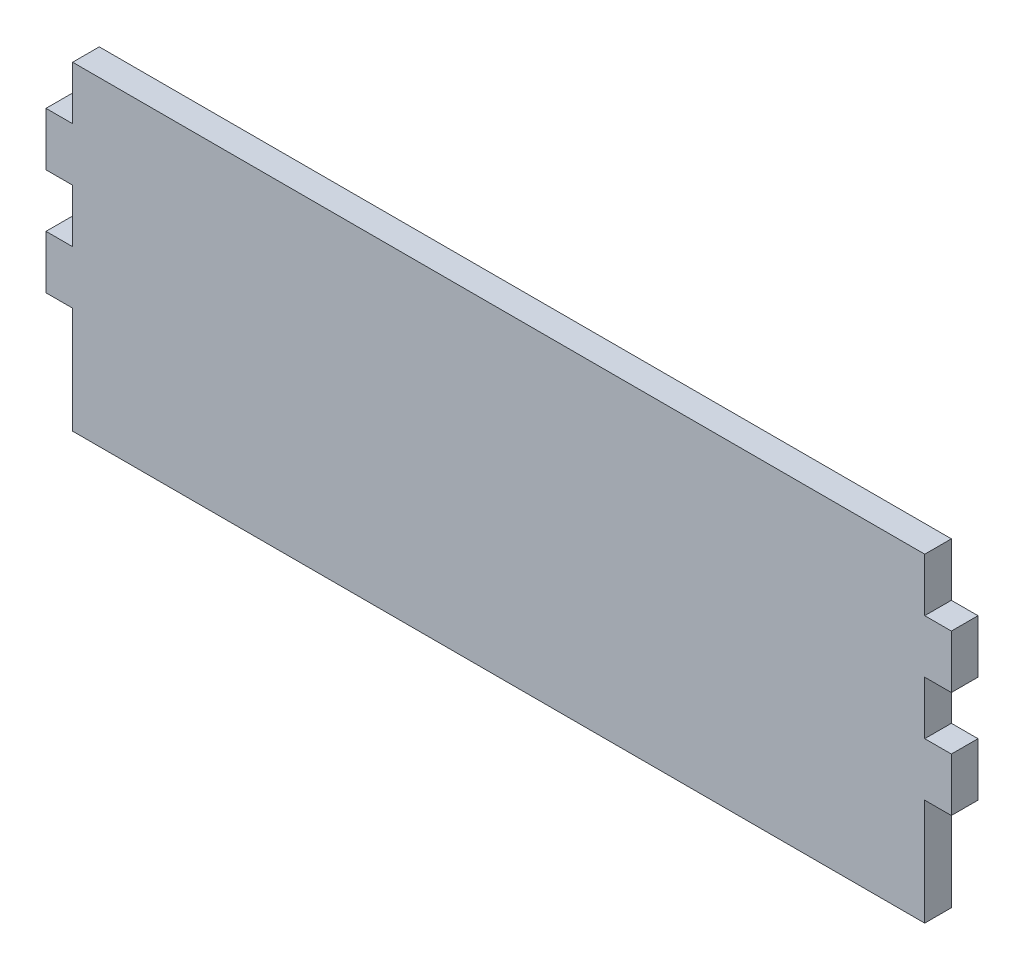
ISO-10303-21;
HEADER;
FILE_DESCRIPTION(('STEP AP214'),'2;1');
FILE_NAME('part.step','',(''),(''),'','','');
FILE_SCHEMA(('AUTOMOTIVE_DESIGN { 1 0 10303 214 1 1 1 1 }'));
ENDSEC;
DATA;
#1=APPLICATION_CONTEXT('core data for automotive mechanical design processes');
#2=APPLICATION_PROTOCOL_DEFINITION('international standard','automotive_design',2000,#1);
#3=PRODUCT_CONTEXT('',#1,'mechanical');
#4=PRODUCT('Part','Part','',(#3));
#5=PRODUCT_RELATED_PRODUCT_CATEGORY('part','',(#4));
#6=PRODUCT_DEFINITION_FORMATION('','',#4);
#7=PRODUCT_DEFINITION_CONTEXT('part definition',#1,'design');
#8=PRODUCT_DEFINITION('design','',#6,#7);
#9=PRODUCT_DEFINITION_SHAPE('','',#8);
#10=(LENGTH_UNIT() NAMED_UNIT(*) SI_UNIT(.MILLI.,.METRE.));
#11=(NAMED_UNIT(*) PLANE_ANGLE_UNIT() SI_UNIT($,.RADIAN.));
#12=(NAMED_UNIT(*) SI_UNIT($,.STERADIAN.) SOLID_ANGLE_UNIT());
#13=UNCERTAINTY_MEASURE_WITH_UNIT(LENGTH_MEASURE(1.E-05),#10,'distance_accuracy_value','');
#14=(GEOMETRIC_REPRESENTATION_CONTEXT(3) GLOBAL_UNCERTAINTY_ASSIGNED_CONTEXT((#13)) GLOBAL_UNIT_ASSIGNED_CONTEXT((#10,
#11,#12)) REPRESENTATION_CONTEXT('',''));
#15=CARTESIAN_POINT('',(0.,0.,0.));
#16=DIRECTION('',(0.,0.,1.));
#17=DIRECTION('',(1.,0.,0.));
#18=AXIS2_PLACEMENT_3D('',#15,#16,#17);
#19=CARTESIAN_POINT('',(40.,25.,2.5));
#20=DIRECTION('',(-1.,0.,0.));
#21=DIRECTION('',(0.,-1.,0.));
#22=AXIS2_PLACEMENT_3D('',#19,#20,#21);
#23=PLANE('',#22);
#24=DIRECTION('',(0.,1.,0.));
#25=VECTOR('',#24,1.);
#26=CARTESIAN_POINT('',(40.,25.,0.));
#27=LINE('',#26,#25);
#28=CARTESIAN_POINT('',(40.,25.,0.));
#29=VERTEX_POINT('',#28);
#30=CARTESIAN_POINT('',(40.,30.,0.));
#31=VERTEX_POINT('',#30);
#32=EDGE_CURVE('E201',#29,#31,#27,.T.);
#33=ORIENTED_EDGE('',*,*,#32,.T.);
#34=DIRECTION('',(0.,0.,-1.));
#35=VECTOR('',#34,1.);
#36=CARTESIAN_POINT('',(40.,30.,2.5));
#37=LINE('',#36,#35);
#38=CARTESIAN_POINT('',(40.,30.,2.5));
#39=VERTEX_POINT('',#38);
#40=EDGE_CURVE('E11',#39,#31,#37,.T.);
#41=ORIENTED_EDGE('',*,*,#40,.F.);
#42=DIRECTION('',(0.,1.,0.));
#43=VECTOR('',#42,1.);
#44=CARTESIAN_POINT('',(40.,25.,2.5));
#45=LINE('',#44,#43);
#46=CARTESIAN_POINT('',(40.,25.,2.5));
#47=VERTEX_POINT('',#46);
#48=EDGE_CURVE('E239',#47,#39,#45,.T.);
#49=ORIENTED_EDGE('',*,*,#48,.F.);
#50=DIRECTION('',(0.,0.,-1.));
#51=VECTOR('',#50,1.);
#52=CARTESIAN_POINT('',(40.,25.,2.5));
#53=LINE('',#52,#51);
#54=EDGE_CURVE('E197',#47,#29,#53,.T.);
#55=ORIENTED_EDGE('',*,*,#54,.T.);
#56=EDGE_LOOP('',(#33,#41,#49,#55));
#57=FACE_BOUND('',#56,.T.);
#58=ADVANCED_FACE('F33',(#57),#23,.F.);
#59=CARTESIAN_POINT('',(-40.,30.,2.5));
#60=DIRECTION('',(0.,-1.,0.));
#61=DIRECTION('',(0.,0.,-1.));
#62=AXIS2_PLACEMENT_3D('',#59,#60,#61);
#63=PLANE('',#62);
#64=DIRECTION('',(-1.,0.,0.));
#65=VECTOR('',#64,1.);
#66=CARTESIAN_POINT('',(-40.,30.,0.));
#67=LINE('',#66,#65);
#68=CARTESIAN_POINT('',(-40.,30.,0.));
#69=VERTEX_POINT('',#68);
#70=EDGE_CURVE('E204',#31,#69,#67,.T.);
#71=ORIENTED_EDGE('',*,*,#70,.T.);
#72=DIRECTION('',(0.,0.,-1.));
#73=VECTOR('',#72,1.);
#74=CARTESIAN_POINT('',(-40.,30.,2.5));
#75=LINE('',#74,#73);
#76=CARTESIAN_POINT('',(-40.,30.,2.5));
#77=VERTEX_POINT('',#76);
#78=EDGE_CURVE('E41',#77,#69,#75,.T.);
#79=ORIENTED_EDGE('',*,*,#78,.F.);
#80=DIRECTION('',(-1.,0.,0.));
#81=VECTOR('',#80,1.);
#82=CARTESIAN_POINT('',(-40.,30.,2.5));
#83=LINE('',#82,#81);
#84=EDGE_CURVE('E128',#39,#77,#83,.T.);
#85=ORIENTED_EDGE('',*,*,#84,.F.);
#86=ORIENTED_EDGE('',*,*,#40,.T.);
#87=EDGE_LOOP('',(#71,#79,#85,#86));
#88=FACE_BOUND('',#87,.T.);
#89=ADVANCED_FACE('F357',(#88),#63,.F.);
#90=CARTESIAN_POINT('',(-40.,25.,2.5));
#91=DIRECTION('',(1.,0.,0.));
#92=DIRECTION('',(0.,1.,0.));
#93=AXIS2_PLACEMENT_3D('',#90,#91,#92);
#94=PLANE('',#93);
#95=DIRECTION('',(0.,-1.,0.));
#96=VECTOR('',#95,1.);
#97=CARTESIAN_POINT('',(-40.,25.,0.));
#98=LINE('',#97,#96);
#99=CARTESIAN_POINT('',(-40.,25.,0.));
#100=VERTEX_POINT('',#99);
#101=EDGE_CURVE('E206',#69,#100,#98,.T.);
#102=ORIENTED_EDGE('',*,*,#101,.T.);
#103=DIRECTION('',(0.,0.,-1.));
#104=VECTOR('',#103,1.);
#105=CARTESIAN_POINT('',(-40.,25.,2.5));
#106=LINE('',#105,#104);
#107=CARTESIAN_POINT('',(-40.,25.,2.5));
#108=VERTEX_POINT('',#107);
#109=EDGE_CURVE('E282',#108,#100,#106,.T.);
#110=ORIENTED_EDGE('',*,*,#109,.F.);
#111=DIRECTION('',(0.,-1.,0.));
#112=VECTOR('',#111,1.);
#113=CARTESIAN_POINT('',(-40.,25.,2.5));
#114=LINE('',#113,#112);
#115=EDGE_CURVE('E290',#77,#108,#114,.T.);
#116=ORIENTED_EDGE('',*,*,#115,.F.);
#117=ORIENTED_EDGE('',*,*,#78,.T.);
#118=EDGE_LOOP('',(#102,#110,#116,#117));
#119=FACE_BOUND('',#118,.T.);
#120=ADVANCED_FACE('F288',(#119),#94,.F.);
#121=CARTESIAN_POINT('',(-40.,25.,2.5));
#122=DIRECTION('',(0.,-1.,0.));
#123=DIRECTION('',(0.,0.,-1.));
#124=AXIS2_PLACEMENT_3D('',#121,#122,#123);
#125=PLANE('',#124);
#126=DIRECTION('',(-1.,0.,0.));
#127=VECTOR('',#126,1.);
#128=CARTESIAN_POINT('',(-40.,25.,0.));
#129=LINE('',#128,#127);
#130=CARTESIAN_POINT('',(-42.5,25.,0.));
#131=VERTEX_POINT('',#130);
#132=EDGE_CURVE('E208',#100,#131,#129,.T.);
#133=ORIENTED_EDGE('',*,*,#132,.T.);
#134=DIRECTION('',(0.,0.,-1.));
#135=VECTOR('',#134,1.);
#136=CARTESIAN_POINT('',(-42.5,25.,2.5));
#137=LINE('',#136,#135);
#138=CARTESIAN_POINT('',(-42.5,25.,2.5));
#139=VERTEX_POINT('',#138);
#140=EDGE_CURVE('E279',#139,#131,#137,.T.);
#141=ORIENTED_EDGE('',*,*,#140,.F.);
#142=DIRECTION('',(-1.,0.,0.));
#143=VECTOR('',#142,1.);
#144=CARTESIAN_POINT('',(-40.,25.,2.5));
#145=LINE('',#144,#143);
#146=EDGE_CURVE('E308',#108,#139,#145,.T.);
#147=ORIENTED_EDGE('',*,*,#146,.F.);
#148=ORIENTED_EDGE('',*,*,#109,.T.);
#149=EDGE_LOOP('',(#133,#141,#147,#148));
#150=FACE_BOUND('',#149,.T.);
#151=ADVANCED_FACE('F299',(#150),#125,.F.);
#152=CARTESIAN_POINT('',(-42.5,25.,2.5));
#153=DIRECTION('',(1.,0.,0.));
#154=DIRECTION('',(0.,1.,0.));
#155=AXIS2_PLACEMENT_3D('',#152,#153,#154);
#156=PLANE('',#155);
#157=DIRECTION('',(0.,-1.,0.));
#158=VECTOR('',#157,1.);
#159=CARTESIAN_POINT('',(-42.5,25.,0.));
#160=LINE('',#159,#158);
#161=CARTESIAN_POINT('',(-42.5,20.,0.));
#162=VERTEX_POINT('',#161);
#163=EDGE_CURVE('E210',#131,#162,#160,.T.);
#164=ORIENTED_EDGE('',*,*,#163,.T.);
#165=DIRECTION('',(0.,0.,-1.));
#166=VECTOR('',#165,1.);
#167=CARTESIAN_POINT('',(-42.5,20.,2.5));
#168=LINE('',#167,#166);
#169=CARTESIAN_POINT('',(-42.5,20.,2.5));
#170=VERTEX_POINT('',#169);
#171=EDGE_CURVE('E276',#170,#162,#168,.T.);
#172=ORIENTED_EDGE('',*,*,#171,.F.);
#173=DIRECTION('',(0.,-1.,0.));
#174=VECTOR('',#173,1.);
#175=CARTESIAN_POINT('',(-42.5,25.,2.5));
#176=LINE('',#175,#174);
#177=EDGE_CURVE('E305',#139,#170,#176,.T.);
#178=ORIENTED_EDGE('',*,*,#177,.F.);
#179=ORIENTED_EDGE('',*,*,#140,.T.);
#180=EDGE_LOOP('',(#164,#172,#178,#179));
#181=FACE_BOUND('',#180,.T.);
#182=ADVANCED_FACE('F303',(#181),#156,.F.);
#183=CARTESIAN_POINT('',(-40.,20.,2.5));
#184=DIRECTION('',(0.,1.,0.));
#185=DIRECTION('',(0.,0.,1.));
#186=AXIS2_PLACEMENT_3D('',#183,#184,#185);
#187=PLANE('',#186);
#188=DIRECTION('',(1.,0.,0.));
#189=VECTOR('',#188,1.);
#190=CARTESIAN_POINT('',(-40.,20.,0.));
#191=LINE('',#190,#189);
#192=CARTESIAN_POINT('',(-40.,20.,0.));
#193=VERTEX_POINT('',#192);
#194=EDGE_CURVE('E212',#162,#193,#191,.T.);
#195=ORIENTED_EDGE('',*,*,#194,.T.);
#196=DIRECTION('',(0.,0.,-1.));
#197=VECTOR('',#196,1.);
#198=CARTESIAN_POINT('',(-40.,20.,2.5));
#199=LINE('',#198,#197);
#200=CARTESIAN_POINT('',(-40.,20.,2.5));
#201=VERTEX_POINT('',#200);
#202=EDGE_CURVE('E273',#201,#193,#199,.T.);
#203=ORIENTED_EDGE('',*,*,#202,.F.);
#204=DIRECTION('',(1.,0.,0.));
#205=VECTOR('',#204,1.);
#206=CARTESIAN_POINT('',(-40.,20.,2.5));
#207=LINE('',#206,#205);
#208=EDGE_CURVE('E307',#170,#201,#207,.T.);
#209=ORIENTED_EDGE('',*,*,#208,.F.);
#210=ORIENTED_EDGE('',*,*,#171,.T.);
#211=EDGE_LOOP('',(#195,#203,#209,#210));
#212=FACE_BOUND('',#211,.T.);
#213=ADVANCED_FACE('F370',(#212),#187,.F.);
#214=CARTESIAN_POINT('',(-40.,15.,2.5));
#215=DIRECTION('',(1.,0.,0.));
#216=DIRECTION('',(0.,1.,0.));
#217=AXIS2_PLACEMENT_3D('',#214,#215,#216);
#218=PLANE('',#217);
#219=DIRECTION('',(0.,-1.,0.));
#220=VECTOR('',#219,1.);
#221=CARTESIAN_POINT('',(-40.,15.,0.));
#222=LINE('',#221,#220);
#223=CARTESIAN_POINT('',(-40.,15.,0.));
#224=VERTEX_POINT('',#223);
#225=EDGE_CURVE('E214',#193,#224,#222,.T.);
#226=ORIENTED_EDGE('',*,*,#225,.T.);
#227=DIRECTION('',(0.,0.,-1.));
#228=VECTOR('',#227,1.);
#229=CARTESIAN_POINT('',(-40.,15.,2.5));
#230=LINE('',#229,#228);
#231=CARTESIAN_POINT('',(-40.,15.,2.5));
#232=VERTEX_POINT('',#231);
#233=EDGE_CURVE('E270',#232,#224,#230,.T.);
#234=ORIENTED_EDGE('',*,*,#233,.F.);
#235=DIRECTION('',(0.,-1.,0.));
#236=VECTOR('',#235,1.);
#237=CARTESIAN_POINT('',(-40.,15.,2.5));
#238=LINE('',#237,#236);
#239=EDGE_CURVE('E310',#201,#232,#238,.T.);
#240=ORIENTED_EDGE('',*,*,#239,.F.);
#241=ORIENTED_EDGE('',*,*,#202,.T.);
#242=EDGE_LOOP('',(#226,#234,#240,#241));
#243=FACE_BOUND('',#242,.T.);
#244=ADVANCED_FACE('F373',(#243),#218,.F.);
#245=CARTESIAN_POINT('',(-40.,15.,2.5));
#246=DIRECTION('',(0.,-1.,0.));
#247=DIRECTION('',(0.,0.,-1.));
#248=AXIS2_PLACEMENT_3D('',#245,#246,#247);
#249=PLANE('',#248);
#250=DIRECTION('',(-1.,0.,0.));
#251=VECTOR('',#250,1.);
#252=CARTESIAN_POINT('',(-40.,15.,0.));
#253=LINE('',#252,#251);
#254=CARTESIAN_POINT('',(-42.5,15.,0.));
#255=VERTEX_POINT('',#254);
#256=EDGE_CURVE('E216',#224,#255,#253,.T.);
#257=ORIENTED_EDGE('',*,*,#256,.T.);
#258=DIRECTION('',(0.,0.,-1.));
#259=VECTOR('',#258,1.);
#260=CARTESIAN_POINT('',(-42.5,15.,2.5));
#261=LINE('',#260,#259);
#262=CARTESIAN_POINT('',(-42.5,15.,2.5));
#263=VERTEX_POINT('',#262);
#264=EDGE_CURVE('E267',#263,#255,#261,.T.);
#265=ORIENTED_EDGE('',*,*,#264,.F.);
#266=DIRECTION('',(-1.,0.,0.));
#267=VECTOR('',#266,1.);
#268=CARTESIAN_POINT('',(-40.,15.,2.5));
#269=LINE('',#268,#267);
#270=EDGE_CURVE('E316',#232,#263,#269,.T.);
#271=ORIENTED_EDGE('',*,*,#270,.F.);
#272=ORIENTED_EDGE('',*,*,#233,.T.);
#273=EDGE_LOOP('',(#257,#265,#271,#272));
#274=FACE_BOUND('',#273,.T.);
#275=ADVANCED_FACE('F377',(#274),#249,.F.);
#276=CARTESIAN_POINT('',(-42.5,15.,2.5));
#277=DIRECTION('',(1.,0.,0.));
#278=DIRECTION('',(0.,0.,-1.));
#279=AXIS2_PLACEMENT_3D('',#276,#277,#278);
#280=PLANE('',#279);
#281=DIRECTION('',(0.,-1.,0.));
#282=VECTOR('',#281,1.);
#283=CARTESIAN_POINT('',(-42.5,15.,0.));
#284=LINE('',#283,#282);
#285=CARTESIAN_POINT('',(-42.5,9.99999999999997,0.));
#286=VERTEX_POINT('',#285);
#287=EDGE_CURVE('E218',#255,#286,#284,.T.);
#288=ORIENTED_EDGE('',*,*,#287,.T.);
#289=DIRECTION('',(0.,0.,-1.));
#290=VECTOR('',#289,1.);
#291=CARTESIAN_POINT('',(-42.5,9.99999999999997,2.5));
#292=LINE('',#291,#290);
#293=CARTESIAN_POINT('',(-42.5,9.99999999999997,2.5));
#294=VERTEX_POINT('',#293);
#295=EDGE_CURVE('E264',#294,#286,#292,.T.);
#296=ORIENTED_EDGE('',*,*,#295,.F.);
#297=DIRECTION('',(0.,-1.,0.));
#298=VECTOR('',#297,1.);
#299=CARTESIAN_POINT('',(-42.5,15.,2.5));
#300=LINE('',#299,#298);
#301=EDGE_CURVE('E318',#263,#294,#300,.T.);
#302=ORIENTED_EDGE('',*,*,#301,.F.);
#303=ORIENTED_EDGE('',*,*,#264,.T.);
#304=EDGE_LOOP('',(#288,#296,#302,#303));
#305=FACE_BOUND('',#304,.T.);
#306=ADVANCED_FACE('F381',(#305),#280,.F.);
#307=CARTESIAN_POINT('',(-40.,9.99999999999997,2.5));
#308=DIRECTION('',(0.,1.,0.));
#309=DIRECTION('',(0.,0.,1.));
#310=AXIS2_PLACEMENT_3D('',#307,#308,#309);
#311=PLANE('',#310);
#312=DIRECTION('',(1.,0.,0.));
#313=VECTOR('',#312,1.);
#314=CARTESIAN_POINT('',(-40.,9.99999999999997,0.));
#315=LINE('',#314,#313);
#316=CARTESIAN_POINT('',(-40.,9.99999999999997,0.));
#317=VERTEX_POINT('',#316);
#318=EDGE_CURVE('E220',#286,#317,#315,.T.);
#319=ORIENTED_EDGE('',*,*,#318,.T.);
#320=DIRECTION('',(0.,0.,-1.));
#321=VECTOR('',#320,1.);
#322=CARTESIAN_POINT('',(-40.,9.99999999999997,2.5));
#323=LINE('',#322,#321);
#324=CARTESIAN_POINT('',(-40.,9.99999999999997,2.5));
#325=VERTEX_POINT('',#324);
#326=EDGE_CURVE('E261',#325,#317,#323,.T.);
#327=ORIENTED_EDGE('',*,*,#326,.F.);
#328=DIRECTION('',(1.,0.,0.));
#329=VECTOR('',#328,1.);
#330=CARTESIAN_POINT('',(-40.,9.99999999999997,2.5));
#331=LINE('',#330,#329);
#332=EDGE_CURVE('E320',#294,#325,#331,.T.);
#333=ORIENTED_EDGE('',*,*,#332,.F.);
#334=ORIENTED_EDGE('',*,*,#295,.T.);
#335=EDGE_LOOP('',(#319,#327,#333,#334));
#336=FACE_BOUND('',#335,.T.);
#337=ADVANCED_FACE('F385',(#336),#311,.F.);
#338=CARTESIAN_POINT('',(-40.,0.,2.5));
#339=DIRECTION('',(1.,0.,0.));
#340=DIRECTION('',(0.,1.,0.));
#341=AXIS2_PLACEMENT_3D('',#338,#339,#340);
#342=PLANE('',#341);
#343=DIRECTION('',(0.,-1.,0.));
#344=VECTOR('',#343,1.);
#345=CARTESIAN_POINT('',(-40.,0.,0.));
#346=LINE('',#345,#344);
#347=CARTESIAN_POINT('',(-40.,0.,0.));
#348=VERTEX_POINT('',#347);
#349=EDGE_CURVE('E222',#317,#348,#346,.T.);
#350=ORIENTED_EDGE('',*,*,#349,.T.);
#351=DIRECTION('',(0.,0.,-1.));
#352=VECTOR('',#351,1.);
#353=CARTESIAN_POINT('',(-40.,0.,2.5));
#354=LINE('',#353,#352);
#355=CARTESIAN_POINT('',(-40.,0.,2.5));
#356=VERTEX_POINT('',#355);
#357=EDGE_CURVE('E258',#356,#348,#354,.T.);
#358=ORIENTED_EDGE('',*,*,#357,.F.);
#359=DIRECTION('',(0.,-1.,0.));
#360=VECTOR('',#359,1.);
#361=CARTESIAN_POINT('',(-40.,0.,2.5));
#362=LINE('',#361,#360);
#363=EDGE_CURVE('E322',#325,#356,#362,.T.);
#364=ORIENTED_EDGE('',*,*,#363,.F.);
#365=ORIENTED_EDGE('',*,*,#326,.T.);
#366=EDGE_LOOP('',(#350,#358,#364,#365));
#367=FACE_BOUND('',#366,.T.);
#368=ADVANCED_FACE('F389',(#367),#342,.F.);
#369=CARTESIAN_POINT('',(-40.,0.,2.5));
#370=DIRECTION('',(0.,1.,0.));
#371=DIRECTION('',(0.,0.,1.));
#372=AXIS2_PLACEMENT_3D('',#369,#370,#371);
#373=PLANE('',#372);
#374=DIRECTION('',(1.,0.,0.));
#375=VECTOR('',#374,1.);
#376=CARTESIAN_POINT('',(-40.,0.,0.));
#377=LINE('',#376,#375);
#378=CARTESIAN_POINT('',(40.,0.,0.));
#379=VERTEX_POINT('',#378);
#380=EDGE_CURVE('E224',#348,#379,#377,.T.);
#381=ORIENTED_EDGE('',*,*,#380,.T.);
#382=DIRECTION('',(0.,0.,-1.));
#383=VECTOR('',#382,1.);
#384=CARTESIAN_POINT('',(40.,0.,2.5));
#385=LINE('',#384,#383);
#386=CARTESIAN_POINT('',(40.,0.,2.5));
#387=VERTEX_POINT('',#386);
#388=EDGE_CURVE('E255',#387,#379,#385,.T.);
#389=ORIENTED_EDGE('',*,*,#388,.F.);
#390=DIRECTION('',(1.,0.,0.));
#391=VECTOR('',#390,1.);
#392=CARTESIAN_POINT('',(-40.,0.,2.5));
#393=LINE('',#392,#391);
#394=EDGE_CURVE('E324',#356,#387,#393,.T.);
#395=ORIENTED_EDGE('',*,*,#394,.F.);
#396=ORIENTED_EDGE('',*,*,#357,.T.);
#397=EDGE_LOOP('',(#381,#389,#395,#396));
#398=FACE_BOUND('',#397,.T.);
#399=ADVANCED_FACE('F393',(#398),#373,.F.);
#400=CARTESIAN_POINT('',(40.,0.,2.5));
#401=DIRECTION('',(-1.,0.,0.));
#402=DIRECTION('',(0.,-1.,0.));
#403=AXIS2_PLACEMENT_3D('',#400,#401,#402);
#404=PLANE('',#403);
#405=DIRECTION('',(0.,1.,0.));
#406=VECTOR('',#405,1.);
#407=CARTESIAN_POINT('',(40.,0.,0.));
#408=LINE('',#407,#406);
#409=CARTESIAN_POINT('',(40.,9.99999999999997,0.));
#410=VERTEX_POINT('',#409);
#411=EDGE_CURVE('E226',#379,#410,#408,.T.);
#412=ORIENTED_EDGE('',*,*,#411,.T.);
#413=DIRECTION('',(0.,0.,-1.));
#414=VECTOR('',#413,1.);
#415=CARTESIAN_POINT('',(40.,9.99999999999997,2.5));
#416=LINE('',#415,#414);
#417=CARTESIAN_POINT('',(40.,9.99999999999997,2.5));
#418=VERTEX_POINT('',#417);
#419=EDGE_CURVE('E252',#418,#410,#416,.T.);
#420=ORIENTED_EDGE('',*,*,#419,.F.);
#421=DIRECTION('',(0.,1.,0.));
#422=VECTOR('',#421,1.);
#423=CARTESIAN_POINT('',(40.,0.,2.5));
#424=LINE('',#423,#422);
#425=EDGE_CURVE('E326',#387,#418,#424,.T.);
#426=ORIENTED_EDGE('',*,*,#425,.F.);
#427=ORIENTED_EDGE('',*,*,#388,.T.);
#428=EDGE_LOOP('',(#412,#420,#426,#427));
#429=FACE_BOUND('',#428,.T.);
#430=ADVANCED_FACE('F397',(#429),#404,.F.);
#431=CARTESIAN_POINT('',(40.,9.99999999999997,2.5));
#432=DIRECTION('',(0.,1.,0.));
#433=DIRECTION('',(0.,0.,1.));
#434=AXIS2_PLACEMENT_3D('',#431,#432,#433);
#435=PLANE('',#434);
#436=DIRECTION('',(1.,0.,0.));
#437=VECTOR('',#436,1.);
#438=CARTESIAN_POINT('',(40.,9.99999999999997,0.));
#439=LINE('',#438,#437);
#440=CARTESIAN_POINT('',(42.5,9.99999999999997,0.));
#441=VERTEX_POINT('',#440);
#442=EDGE_CURVE('E228',#410,#441,#439,.T.);
#443=ORIENTED_EDGE('',*,*,#442,.T.);
#444=DIRECTION('',(0.,0.,-1.));
#445=VECTOR('',#444,1.);
#446=CARTESIAN_POINT('',(42.5,9.99999999999997,2.5));
#447=LINE('',#446,#445);
#448=CARTESIAN_POINT('',(42.5,9.99999999999997,2.5));
#449=VERTEX_POINT('',#448);
#450=EDGE_CURVE('E249',#449,#441,#447,.T.);
#451=ORIENTED_EDGE('',*,*,#450,.F.);
#452=DIRECTION('',(1.,0.,0.));
#453=VECTOR('',#452,1.);
#454=CARTESIAN_POINT('',(40.,9.99999999999997,2.5));
#455=LINE('',#454,#453);
#456=EDGE_CURVE('E328',#418,#449,#455,.T.);
#457=ORIENTED_EDGE('',*,*,#456,.F.);
#458=ORIENTED_EDGE('',*,*,#419,.T.);
#459=EDGE_LOOP('',(#443,#451,#457,#458));
#460=FACE_BOUND('',#459,.T.);
#461=ADVANCED_FACE('F401',(#460),#435,.F.);
#462=CARTESIAN_POINT('',(42.5,15.,2.5));
#463=DIRECTION('',(-1.,0.,0.));
#464=DIRECTION('',(0.,0.,1.));
#465=AXIS2_PLACEMENT_3D('',#462,#463,#464);
#466=PLANE('',#465);
#467=DIRECTION('',(0.,1.,0.));
#468=VECTOR('',#467,1.);
#469=CARTESIAN_POINT('',(42.5,15.,0.));
#470=LINE('',#469,#468);
#471=CARTESIAN_POINT('',(42.5,15.,0.));
#472=VERTEX_POINT('',#471);
#473=EDGE_CURVE('E230',#441,#472,#470,.T.);
#474=ORIENTED_EDGE('',*,*,#473,.T.);
#475=DIRECTION('',(0.,0.,-1.));
#476=VECTOR('',#475,1.);
#477=CARTESIAN_POINT('',(42.5,15.,2.5));
#478=LINE('',#477,#476);
#479=CARTESIAN_POINT('',(42.5,15.,2.5));
#480=VERTEX_POINT('',#479);
#481=EDGE_CURVE('E246',#480,#472,#478,.T.);
#482=ORIENTED_EDGE('',*,*,#481,.F.);
#483=DIRECTION('',(0.,1.,0.));
#484=VECTOR('',#483,1.);
#485=CARTESIAN_POINT('',(42.5,15.,2.5));
#486=LINE('',#485,#484);
#487=EDGE_CURVE('E330',#449,#480,#486,.T.);
#488=ORIENTED_EDGE('',*,*,#487,.F.);
#489=ORIENTED_EDGE('',*,*,#450,.T.);
#490=EDGE_LOOP('',(#474,#482,#488,#489));
#491=FACE_BOUND('',#490,.T.);
#492=ADVANCED_FACE('F405',(#491),#466,.F.);
#493=CARTESIAN_POINT('',(40.,15.,2.5));
#494=DIRECTION('',(0.,-1.,0.));
#495=DIRECTION('',(0.,0.,-1.));
#496=AXIS2_PLACEMENT_3D('',#493,#494,#495);
#497=PLANE('',#496);
#498=DIRECTION('',(-1.,0.,0.));
#499=VECTOR('',#498,1.);
#500=CARTESIAN_POINT('',(40.,15.,0.));
#501=LINE('',#500,#499);
#502=CARTESIAN_POINT('',(40.,15.,0.));
#503=VERTEX_POINT('',#502);
#504=EDGE_CURVE('E232',#472,#503,#501,.T.);
#505=ORIENTED_EDGE('',*,*,#504,.T.);
#506=DIRECTION('',(0.,0.,-1.));
#507=VECTOR('',#506,1.);
#508=CARTESIAN_POINT('',(40.,15.,2.5));
#509=LINE('',#508,#507);
#510=CARTESIAN_POINT('',(40.,15.,2.5));
#511=VERTEX_POINT('',#510);
#512=EDGE_CURVE('E243',#511,#503,#509,.T.);
#513=ORIENTED_EDGE('',*,*,#512,.F.);
#514=DIRECTION('',(-1.,0.,0.));
#515=VECTOR('',#514,1.);
#516=CARTESIAN_POINT('',(40.,15.,2.5));
#517=LINE('',#516,#515);
#518=EDGE_CURVE('E332',#480,#511,#517,.T.);
#519=ORIENTED_EDGE('',*,*,#518,.F.);
#520=ORIENTED_EDGE('',*,*,#481,.T.);
#521=EDGE_LOOP('',(#505,#513,#519,#520));
#522=FACE_BOUND('',#521,.T.);
#523=ADVANCED_FACE('F338',(#522),#497,.F.);
#524=CARTESIAN_POINT('',(40.,15.,2.5));
#525=DIRECTION('',(-1.,0.,0.));
#526=DIRECTION('',(0.,-1.,0.));
#527=AXIS2_PLACEMENT_3D('',#524,#525,#526);
#528=PLANE('',#527);
#529=DIRECTION('',(0.,1.,0.));
#530=VECTOR('',#529,1.);
#531=CARTESIAN_POINT('',(40.,15.,0.));
#532=LINE('',#531,#530);
#533=CARTESIAN_POINT('',(40.,20.,0.));
#534=VERTEX_POINT('',#533);
#535=EDGE_CURVE('E234',#503,#534,#532,.T.);
#536=ORIENTED_EDGE('',*,*,#535,.T.);
#537=DIRECTION('',(0.,0.,-1.));
#538=VECTOR('',#537,1.);
#539=CARTESIAN_POINT('',(40.,20.,2.5));
#540=LINE('',#539,#538);
#541=CARTESIAN_POINT('',(40.,20.,2.5));
#542=VERTEX_POINT('',#541);
#543=EDGE_CURVE('E192',#542,#534,#540,.T.);
#544=ORIENTED_EDGE('',*,*,#543,.F.);
#545=DIRECTION('',(0.,1.,0.));
#546=VECTOR('',#545,1.);
#547=CARTESIAN_POINT('',(40.,15.,2.5));
#548=LINE('',#547,#546);
#549=EDGE_CURVE('E183',#511,#542,#548,.T.);
#550=ORIENTED_EDGE('',*,*,#549,.F.);
#551=ORIENTED_EDGE('',*,*,#512,.T.);
#552=EDGE_LOOP('',(#536,#544,#550,#551));
#553=FACE_BOUND('',#552,.T.);
#554=ADVANCED_FACE('F342',(#553),#528,.F.);
#555=CARTESIAN_POINT('',(40.,20.,2.5));
#556=DIRECTION('',(0.,1.,0.));
#557=DIRECTION('',(0.,0.,1.));
#558=AXIS2_PLACEMENT_3D('',#555,#556,#557);
#559=PLANE('',#558);
#560=DIRECTION('',(1.,0.,0.));
#561=VECTOR('',#560,1.);
#562=CARTESIAN_POINT('',(40.,20.,0.));
#563=LINE('',#562,#561);
#564=CARTESIAN_POINT('',(42.5,20.,0.));
#565=VERTEX_POINT('',#564);
#566=EDGE_CURVE('E191',#534,#565,#563,.T.);
#567=ORIENTED_EDGE('',*,*,#566,.T.);
#568=DIRECTION('',(0.,0.,-1.));
#569=VECTOR('',#568,1.);
#570=CARTESIAN_POINT('',(42.5,20.,2.5));
#571=LINE('',#570,#569);
#572=CARTESIAN_POINT('',(42.5,20.,2.5));
#573=VERTEX_POINT('',#572);
#574=EDGE_CURVE('E188',#573,#565,#571,.T.);
#575=ORIENTED_EDGE('',*,*,#574,.F.);
#576=DIRECTION('',(1.,0.,0.));
#577=VECTOR('',#576,1.);
#578=CARTESIAN_POINT('',(40.,20.,2.5));
#579=LINE('',#578,#577);
#580=EDGE_CURVE('E177',#542,#573,#579,.T.);
#581=ORIENTED_EDGE('',*,*,#580,.F.);
#582=ORIENTED_EDGE('',*,*,#543,.T.);
#583=EDGE_LOOP('',(#567,#575,#581,#582));
#584=FACE_BOUND('',#583,.T.);
#585=ADVANCED_FACE('F189',(#584),#559,.F.);
#586=CARTESIAN_POINT('',(42.5,25.,2.5));
#587=DIRECTION('',(-1.,0.,0.));
#588=DIRECTION('',(0.,-1.,0.));
#589=AXIS2_PLACEMENT_3D('',#586,#587,#588);
#590=PLANE('',#589);
#591=DIRECTION('',(0.,1.,0.));
#592=VECTOR('',#591,1.);
#593=CARTESIAN_POINT('',(42.5,25.,0.));
#594=LINE('',#593,#592);
#595=CARTESIAN_POINT('',(42.5,25.,0.));
#596=VERTEX_POINT('',#595);
#597=EDGE_CURVE('E114',#565,#596,#594,.T.);
#598=ORIENTED_EDGE('',*,*,#597,.T.);
#599=DIRECTION('',(0.,0.,-1.));
#600=VECTOR('',#599,1.);
#601=CARTESIAN_POINT('',(42.5,25.,2.5));
#602=LINE('',#601,#600);
#603=CARTESIAN_POINT('',(42.5,25.,2.5));
#604=VERTEX_POINT('',#603);
#605=EDGE_CURVE('E193',#604,#596,#602,.T.);
#606=ORIENTED_EDGE('',*,*,#605,.F.);
#607=DIRECTION('',(0.,1.,0.));
#608=VECTOR('',#607,1.);
#609=CARTESIAN_POINT('',(42.5,25.,2.5));
#610=LINE('',#609,#608);
#611=EDGE_CURVE('E181',#573,#604,#610,.T.);
#612=ORIENTED_EDGE('',*,*,#611,.F.);
#613=ORIENTED_EDGE('',*,*,#574,.T.);
#614=EDGE_LOOP('',(#598,#606,#612,#613));
#615=FACE_BOUND('',#614,.T.);
#616=ADVANCED_FACE('F195',(#615),#590,.F.);
#617=CARTESIAN_POINT('',(40.,25.,2.5));
#618=DIRECTION('',(0.,-1.,0.));
#619=DIRECTION('',(0.,0.,-1.));
#620=AXIS2_PLACEMENT_3D('',#617,#618,#619);
#621=PLANE('',#620);
#622=DIRECTION('',(-1.,0.,0.));
#623=VECTOR('',#622,1.);
#624=CARTESIAN_POINT('',(40.,25.,0.));
#625=LINE('',#624,#623);
#626=EDGE_CURVE('E120',#596,#29,#625,.T.);
#627=ORIENTED_EDGE('',*,*,#626,.T.);
#628=ORIENTED_EDGE('',*,*,#54,.F.);
#629=DIRECTION('',(-1.,0.,0.));
#630=VECTOR('',#629,1.);
#631=CARTESIAN_POINT('',(40.,25.,2.5));
#632=LINE('',#631,#630);
#633=EDGE_CURVE('E49',#604,#47,#632,.T.);
#634=ORIENTED_EDGE('',*,*,#633,.F.);
#635=ORIENTED_EDGE('',*,*,#605,.T.);
#636=EDGE_LOOP('',(#627,#628,#634,#635));
#637=FACE_BOUND('',#636,.T.);
#638=ADVANCED_FACE('F346',(#637),#621,.F.);
#639=CARTESIAN_POINT('',(0.,0.,2.5));
#640=DIRECTION('',(0.,0.,-1.));
#641=DIRECTION('',(-1.,0.,0.));
#642=AXIS2_PLACEMENT_3D('',#639,#640,#641);
#643=PLANE('',#642);
#644=ORIENTED_EDGE('',*,*,#48,.T.);
#645=ORIENTED_EDGE('',*,*,#84,.T.);
#646=ORIENTED_EDGE('',*,*,#115,.T.);
#647=ORIENTED_EDGE('',*,*,#146,.T.);
#648=ORIENTED_EDGE('',*,*,#177,.T.);
#649=ORIENTED_EDGE('',*,*,#208,.T.);
#650=ORIENTED_EDGE('',*,*,#239,.T.);
#651=ORIENTED_EDGE('',*,*,#270,.T.);
#652=ORIENTED_EDGE('',*,*,#301,.T.);
#653=ORIENTED_EDGE('',*,*,#332,.T.);
#654=ORIENTED_EDGE('',*,*,#363,.T.);
#655=ORIENTED_EDGE('',*,*,#394,.T.);
#656=ORIENTED_EDGE('',*,*,#425,.T.);
#657=ORIENTED_EDGE('',*,*,#456,.T.);
#658=ORIENTED_EDGE('',*,*,#487,.T.);
#659=ORIENTED_EDGE('',*,*,#518,.T.);
#660=ORIENTED_EDGE('',*,*,#549,.T.);
#661=ORIENTED_EDGE('',*,*,#580,.T.);
#662=ORIENTED_EDGE('',*,*,#611,.T.);
#663=ORIENTED_EDGE('',*,*,#633,.T.);
#664=EDGE_LOOP('',(#644,#645,#646,#647,#648,#649,#650,#651,#652,#653,#654,#655,#656,#657,#658,
#659,#660,#661,#662,#663));
#665=FACE_BOUND('',#664,.T.);
#666=ADVANCED_FACE('F179',(#665),#643,.F.);
#667=CARTESIAN_POINT('',(0.,0.,0.));
#668=DIRECTION('',(0.,0.,-1.));
#669=DIRECTION('',(-1.,0.,0.));
#670=AXIS2_PLACEMENT_3D('',#667,#668,#669);
#671=PLANE('',#670);
#672=ORIENTED_EDGE('',*,*,#32,.F.);
#673=ORIENTED_EDGE('',*,*,#626,.F.);
#674=ORIENTED_EDGE('',*,*,#597,.F.);
#675=ORIENTED_EDGE('',*,*,#566,.F.);
#676=ORIENTED_EDGE('',*,*,#535,.F.);
#677=ORIENTED_EDGE('',*,*,#504,.F.);
#678=ORIENTED_EDGE('',*,*,#473,.F.);
#679=ORIENTED_EDGE('',*,*,#442,.F.);
#680=ORIENTED_EDGE('',*,*,#411,.F.);
#681=ORIENTED_EDGE('',*,*,#380,.F.);
#682=ORIENTED_EDGE('',*,*,#349,.F.);
#683=ORIENTED_EDGE('',*,*,#318,.F.);
#684=ORIENTED_EDGE('',*,*,#287,.F.);
#685=ORIENTED_EDGE('',*,*,#256,.F.);
#686=ORIENTED_EDGE('',*,*,#225,.F.);
#687=ORIENTED_EDGE('',*,*,#194,.F.);
#688=ORIENTED_EDGE('',*,*,#163,.F.);
#689=ORIENTED_EDGE('',*,*,#132,.F.);
#690=ORIENTED_EDGE('',*,*,#101,.F.);
#691=ORIENTED_EDGE('',*,*,#70,.F.);
#692=EDGE_LOOP('',(#672,#673,#674,#675,#676,#677,#678,#679,#680,#681,#682,#683,#684,#685,#686,
#687,#688,#689,#690,#691));
#693=FACE_BOUND('',#692,.T.);
#694=ADVANCED_FACE('F294',(#693),#671,.T.);
#695=CLOSED_SHELL('',(#58,#89,#120,#151,#182,#213,#244,#275,#306,#337,#368,#399,#430,#461,#492,
#523,#554,#585,#616,#638,#666,#694));
#696=MANIFOLD_SOLID_BREP('B2',#695);
#697=ADVANCED_BREP_SHAPE_REPRESENTATION('',(#18,#696),#14);
#698=SHAPE_DEFINITION_REPRESENTATION(#9,#697);
ENDSEC;
END-ISO-10303-21;
